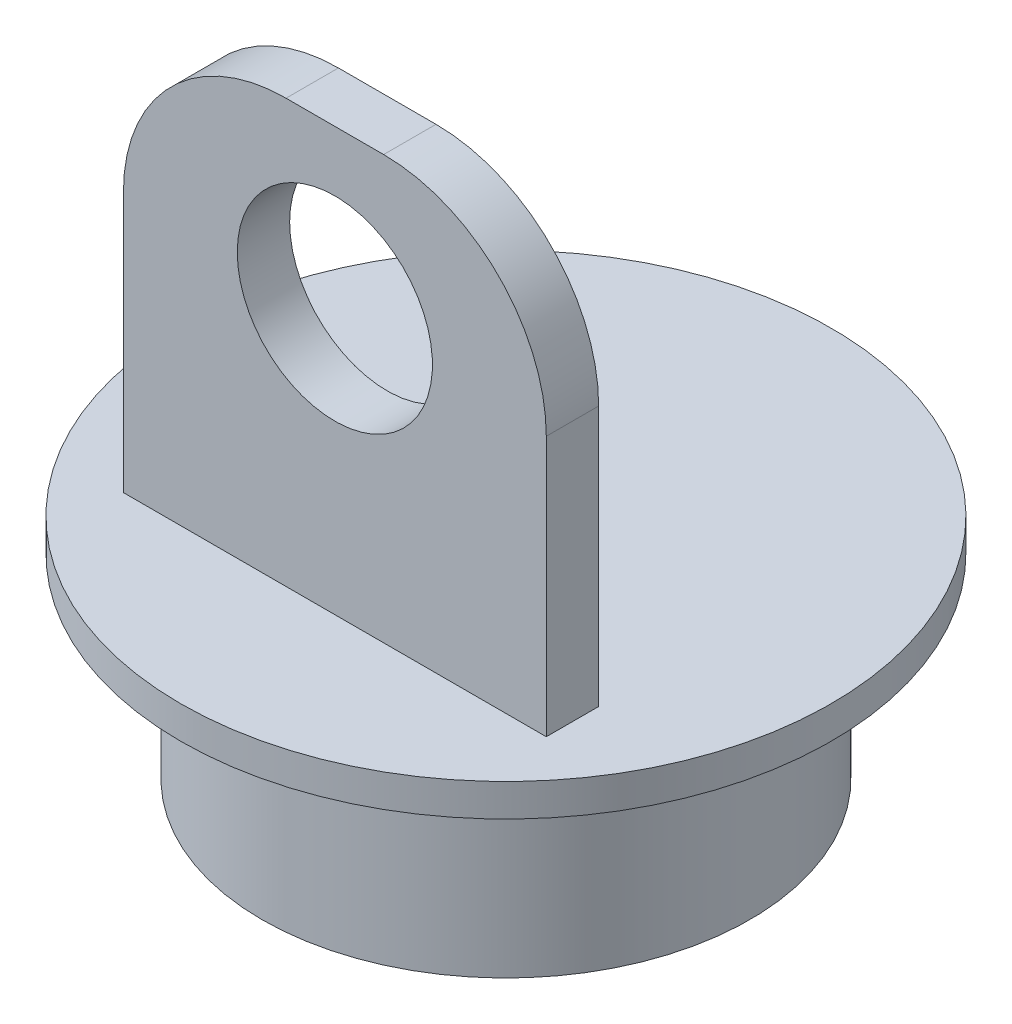
ISO-10303-21;
HEADER;
FILE_DESCRIPTION(('STEP AP214'),'2;1');
FILE_NAME('part.step','',(''),(''),'','','');
FILE_SCHEMA(('AUTOMOTIVE_DESIGN { 1 0 10303 214 1 1 1 1 }'));
ENDSEC;
DATA;
#1=APPLICATION_CONTEXT('core data for automotive mechanical design processes');
#2=APPLICATION_PROTOCOL_DEFINITION('international standard','automotive_design',2000,#1);
#3=PRODUCT_CONTEXT('',#1,'mechanical');
#4=PRODUCT('Part','Part','',(#3));
#5=PRODUCT_RELATED_PRODUCT_CATEGORY('part','',(#4));
#6=PRODUCT_DEFINITION_FORMATION('','',#4);
#7=PRODUCT_DEFINITION_CONTEXT('part definition',#1,'design');
#8=PRODUCT_DEFINITION('design','',#6,#7);
#9=PRODUCT_DEFINITION_SHAPE('','',#8);
#10=(LENGTH_UNIT() NAMED_UNIT(*) SI_UNIT(.MILLI.,.METRE.));
#11=(NAMED_UNIT(*) PLANE_ANGLE_UNIT() SI_UNIT($,.RADIAN.));
#12=(NAMED_UNIT(*) SI_UNIT($,.STERADIAN.) SOLID_ANGLE_UNIT());
#13=UNCERTAINTY_MEASURE_WITH_UNIT(LENGTH_MEASURE(1.E-05),#10,'distance_accuracy_value','');
#14=(GEOMETRIC_REPRESENTATION_CONTEXT(3) GLOBAL_UNCERTAINTY_ASSIGNED_CONTEXT((#13)) GLOBAL_UNIT_ASSIGNED_CONTEXT((#10,
#11,#12)) REPRESENTATION_CONTEXT('',''));
#15=CARTESIAN_POINT('',(0.,0.,0.));
#16=DIRECTION('',(0.,0.,1.));
#17=DIRECTION('',(1.,0.,0.));
#18=AXIS2_PLACEMENT_3D('',#15,#16,#17);
#19=CARTESIAN_POINT('',(0.,35.,0.));
#20=DIRECTION('',(0.,1.,0.));
#21=DIRECTION('',(0.,0.,1.));
#22=AXIS2_PLACEMENT_3D('',#19,#20,#21);
#23=PLANE('',#22);
#24=CARTESIAN_POINT('',(0.,35.,0.));
#25=DIRECTION('',(0.,1.,0.));
#26=DIRECTION('',(0.,0.,1.));
#27=AXIS2_PLACEMENT_3D('',#24,#25,#26);
#28=CIRCLE('',#27,50.);
#29=CARTESIAN_POINT('',(0.,35.,50.));
#30=VERTEX_POINT('',#29);
#31=EDGE_CURVE('E127',#30,#30,#28,.T.);
#32=ORIENTED_EDGE('',*,*,#31,.T.);
#33=EDGE_LOOP('',(#32));
#34=FACE_BOUND('',#33,.T.);
#35=DIRECTION('',(1.,0.,0.));
#36=VECTOR('',#35,1.);
#37=CARTESIAN_POINT('',(-32.5,35.,26.2939562192864));
#38=LINE('',#37,#36);
#39=CARTESIAN_POINT('',(-32.5,35.,26.2939562192864));
#40=VERTEX_POINT('',#39);
#41=CARTESIAN_POINT('',(32.5,35.,26.2939562192864));
#42=VERTEX_POINT('',#41);
#43=EDGE_CURVE('E98',#40,#42,#38,.T.);
#44=ORIENTED_EDGE('',*,*,#43,.F.);
#45=DIRECTION('',(0.,0.,1.));
#46=VECTOR('',#45,1.);
#47=CARTESIAN_POINT('',(-32.5,35.,18.2447859480762));
#48=LINE('',#47,#46);
#49=CARTESIAN_POINT('',(-32.5,35.,18.2447859480762));
#50=VERTEX_POINT('',#49);
#51=EDGE_CURVE('E105',#50,#40,#48,.T.);
#52=ORIENTED_EDGE('',*,*,#51,.F.);
#53=DIRECTION('',(-1.,0.,0.));
#54=VECTOR('',#53,1.);
#55=CARTESIAN_POINT('',(-32.5,35.,18.2447859480762));
#56=LINE('',#55,#54);
#57=CARTESIAN_POINT('',(32.5,35.,18.2447859480762));
#58=VERTEX_POINT('',#57);
#59=EDGE_CURVE('E116',#58,#50,#56,.T.);
#60=ORIENTED_EDGE('',*,*,#59,.F.);
#61=DIRECTION('',(0.,0.,-1.));
#62=VECTOR('',#61,1.);
#63=CARTESIAN_POINT('',(32.5,35.,18.2447859480762));
#64=LINE('',#63,#62);
#65=EDGE_CURVE('E114',#42,#58,#64,.T.);
#66=ORIENTED_EDGE('',*,*,#65,.F.);
#67=EDGE_LOOP('',(#44,#52,#60,#66));
#68=FACE_BOUND('',#67,.T.);
#69=ADVANCED_FACE('F40',(#34,#68),#23,.T.);
#70=CARTESIAN_POINT('',(0.,0.,0.));
#71=DIRECTION('',(0.,1.,0.));
#72=DIRECTION('',(0.,0.,1.));
#73=AXIS2_PLACEMENT_3D('',#70,#71,#72);
#74=PLANE('',#73);
#75=CARTESIAN_POINT('',(0.,0.,0.));
#76=DIRECTION('',(0.,1.,0.));
#77=DIRECTION('',(0.,0.,1.));
#78=AXIS2_PLACEMENT_3D('',#75,#76,#77);
#79=CIRCLE('',#78,37.5);
#80=CARTESIAN_POINT('',(0.,0.,37.5));
#81=VERTEX_POINT('',#80);
#82=EDGE_CURVE('E138',#81,#81,#79,.T.);
#83=ORIENTED_EDGE('',*,*,#82,.F.);
#84=EDGE_LOOP('',(#83));
#85=FACE_BOUND('',#84,.T.);
#86=CARTESIAN_POINT('',(0.,0.,0.));
#87=DIRECTION('',(0.,1.,0.));
#88=DIRECTION('',(0.,0.,1.));
#89=AXIS2_PLACEMENT_3D('',#86,#87,#88);
#90=CIRCLE('',#89,32.5);
#91=CARTESIAN_POINT('',(0.,0.,32.5));
#92=VERTEX_POINT('',#91);
#93=EDGE_CURVE('E135',#92,#92,#90,.T.);
#94=ORIENTED_EDGE('',*,*,#93,.T.);
#95=EDGE_LOOP('',(#94));
#96=FACE_BOUND('',#95,.T.);
#97=ADVANCED_FACE('F174',(#85,#96),#74,.F.);
#98=CARTESIAN_POINT('',(0.,30.,0.));
#99=DIRECTION('',(0.,-1.,0.));
#100=DIRECTION('',(0.,0.,-1.));
#101=AXIS2_PLACEMENT_3D('',#98,#99,#100);
#102=CYLINDRICAL_SURFACE('',#101,37.5);
#103=CARTESIAN_POINT('',(0.,30.,0.));
#104=DIRECTION('',(0.,1.,0.));
#105=DIRECTION('',(0.,0.,1.));
#106=AXIS2_PLACEMENT_3D('',#103,#104,#105);
#107=CIRCLE('',#106,37.5);
#108=CARTESIAN_POINT('',(0.,30.,37.5));
#109=VERTEX_POINT('',#108);
#110=EDGE_CURVE('E139',#109,#109,#107,.T.);
#111=ORIENTED_EDGE('',*,*,#110,.F.);
#112=EDGE_LOOP('',(#111));
#113=FACE_BOUND('',#112,.T.);
#114=ORIENTED_EDGE('',*,*,#82,.T.);
#115=EDGE_LOOP('',(#114));
#116=FACE_BOUND('',#115,.T.);
#117=ADVANCED_FACE('F180',(#113,#116),#102,.T.);
#118=CARTESIAN_POINT('',(0.,30.,0.));
#119=DIRECTION('',(0.,-1.,0.));
#120=DIRECTION('',(0.,0.,-1.));
#121=AXIS2_PLACEMENT_3D('',#118,#119,#120);
#122=CYLINDRICAL_SURFACE('',#121,32.5);
#123=CARTESIAN_POINT('',(0.,30.,0.));
#124=DIRECTION('',(0.,1.,0.));
#125=DIRECTION('',(0.,0.,1.));
#126=AXIS2_PLACEMENT_3D('',#123,#124,#125);
#127=CIRCLE('',#126,32.5);
#128=CARTESIAN_POINT('',(0.,30.,32.5));
#129=VERTEX_POINT('',#128);
#130=EDGE_CURVE('E130',#129,#129,#127,.T.);
#131=ORIENTED_EDGE('',*,*,#130,.T.);
#132=EDGE_LOOP('',(#131));
#133=FACE_BOUND('',#132,.T.);
#134=ORIENTED_EDGE('',*,*,#93,.F.);
#135=EDGE_LOOP('',(#134));
#136=FACE_BOUND('',#135,.T.);
#137=ADVANCED_FACE('F195',(#133,#136),#122,.F.);
#138=CARTESIAN_POINT('',(0.,30.,0.));
#139=DIRECTION('',(0.,1.,0.));
#140=DIRECTION('',(0.,0.,1.));
#141=AXIS2_PLACEMENT_3D('',#138,#139,#140);
#142=PLANE('',#141);
#143=ORIENTED_EDGE('',*,*,#130,.F.);
#144=EDGE_LOOP('',(#143));
#145=FACE_BOUND('',#144,.T.);
#146=ADVANCED_FACE('F191',(#145),#142,.F.);
#147=CARTESIAN_POINT('',(0.,35.,0.));
#148=DIRECTION('',(0.,-1.,0.));
#149=DIRECTION('',(0.,0.,-1.));
#150=AXIS2_PLACEMENT_3D('',#147,#148,#149);
#151=CYLINDRICAL_SURFACE('',#150,50.);
#152=ORIENTED_EDGE('',*,*,#31,.F.);
#153=EDGE_LOOP('',(#152));
#154=FACE_BOUND('',#153,.T.);
#155=CARTESIAN_POINT('',(0.,30.,0.));
#156=DIRECTION('',(0.,1.,0.));
#157=DIRECTION('',(0.,0.,1.));
#158=AXIS2_PLACEMENT_3D('',#155,#156,#157);
#159=CIRCLE('',#158,50.);
#160=CARTESIAN_POINT('',(0.,30.,50.));
#161=VERTEX_POINT('',#160);
#162=EDGE_CURVE('E101',#161,#161,#159,.T.);
#163=ORIENTED_EDGE('',*,*,#162,.T.);
#164=EDGE_LOOP('',(#163));
#165=FACE_BOUND('',#164,.T.);
#166=ADVANCED_FACE('F189',(#154,#165),#151,.T.);
#167=ORIENTED_EDGE('',*,*,#110,.T.);
#168=EDGE_LOOP('',(#167));
#169=FACE_BOUND('',#168,.T.);
#170=ORIENTED_EDGE('',*,*,#162,.F.);
#171=EDGE_LOOP('',(#170));
#172=FACE_BOUND('',#171,.T.);
#173=ADVANCED_FACE('F186',(#169,#172),#142,.F.);
#174=CARTESIAN_POINT('',(-32.5,100.,18.2447859480762));
#175=DIRECTION('',(1.,0.,0.));
#176=DIRECTION('',(0.,0.,-1.));
#177=AXIS2_PLACEMENT_3D('',#174,#175,#176);
#178=PLANE('',#177);
#179=DIRECTION('',(0.,-1.,0.));
#180=VECTOR('',#179,1.);
#181=CARTESIAN_POINT('',(-32.5,100.,26.2939562192864));
#182=LINE('',#181,#180);
#183=CARTESIAN_POINT('',(-32.5,75.,26.2939562192864));
#184=VERTEX_POINT('',#183);
#185=EDGE_CURVE('E92',#184,#40,#182,.T.);
#186=ORIENTED_EDGE('',*,*,#185,.F.);
#187=DIRECTION('',(0.,0.,1.));
#188=VECTOR('',#187,1.);
#189=CARTESIAN_POINT('',(-32.5,75.,18.2447859480762));
#190=LINE('',#189,#188);
#191=CARTESIAN_POINT('',(-32.5,75.,18.2447859480762));
#192=VERTEX_POINT('',#191);
#193=EDGE_CURVE('E63',#184,#192,#190,.F.);
#194=ORIENTED_EDGE('',*,*,#193,.T.);
#195=DIRECTION('',(0.,-1.,0.));
#196=VECTOR('',#195,1.);
#197=CARTESIAN_POINT('',(-32.5,100.,18.2447859480762));
#198=LINE('',#197,#196);
#199=EDGE_CURVE('E107',#192,#50,#198,.T.);
#200=ORIENTED_EDGE('',*,*,#199,.T.);
#201=ORIENTED_EDGE('',*,*,#51,.T.);
#202=EDGE_LOOP('',(#186,#194,#200,#201));
#203=FACE_BOUND('',#202,.T.);
#204=ADVANCED_FACE('F106',(#203),#178,.F.);
#205=CARTESIAN_POINT('',(-32.5,100.,26.2939562192864));
#206=DIRECTION('',(0.,0.,-1.));
#207=DIRECTION('',(-1.,0.,0.));
#208=AXIS2_PLACEMENT_3D('',#205,#206,#207);
#209=PLANE('',#208);
#210=CARTESIAN_POINT('',(0.,75.7573448678723,26.2939562192864));
#211=DIRECTION('',(0.,0.,-1.));
#212=DIRECTION('',(-1.,0.,0.));
#213=AXIS2_PLACEMENT_3D('',#210,#211,#212);
#214=CIRCLE('',#213,15.);
#215=CARTESIAN_POINT('',(-15.,75.7573448678723,26.2939562192864));
#216=VERTEX_POINT('',#215);
#217=EDGE_CURVE('E111',#216,#216,#214,.T.);
#218=ORIENTED_EDGE('',*,*,#217,.T.);
#219=EDGE_LOOP('',(#218));
#220=FACE_BOUND('',#219,.T.);
#221=DIRECTION('',(1.,0.,0.));
#222=VECTOR('',#221,1.);
#223=CARTESIAN_POINT('',(-32.5,100.,26.2939562192864));
#224=LINE('',#223,#222);
#225=CARTESIAN_POINT('',(-7.5,100.,26.2939562192864));
#226=VERTEX_POINT('',#225);
#227=CARTESIAN_POINT('',(7.5,100.,26.2939562192864));
#228=VERTEX_POINT('',#227);
#229=EDGE_CURVE('E121',#226,#228,#224,.T.);
#230=ORIENTED_EDGE('',*,*,#229,.F.);
#231=CARTESIAN_POINT('',(-7.5,75.,26.2939562192864));
#232=DIRECTION('',(0.,0.,-1.));
#233=DIRECTION('',(-1.,0.,0.));
#234=AXIS2_PLACEMENT_3D('',#231,#232,#233);
#235=CIRCLE('',#234,25.);
#236=EDGE_CURVE('E100',#226,#184,#235,.F.);
#237=ORIENTED_EDGE('',*,*,#236,.T.);
#238=ORIENTED_EDGE('',*,*,#185,.T.);
#239=ORIENTED_EDGE('',*,*,#43,.T.);
#240=DIRECTION('',(0.,-1.,0.));
#241=VECTOR('',#240,1.);
#242=CARTESIAN_POINT('',(32.5,100.,26.2939562192864));
#243=LINE('',#242,#241);
#244=CARTESIAN_POINT('',(32.5,75.,26.2939562192864));
#245=VERTEX_POINT('',#244);
#246=EDGE_CURVE('E102',#245,#42,#243,.T.);
#247=ORIENTED_EDGE('',*,*,#246,.F.);
#248=CARTESIAN_POINT('',(7.5,75.,26.2939562192864));
#249=DIRECTION('',(0.,0.,-1.));
#250=DIRECTION('',(-1.,0.,0.));
#251=AXIS2_PLACEMENT_3D('',#248,#249,#250);
#252=CIRCLE('',#251,25.);
#253=EDGE_CURVE('E150',#245,#228,#252,.F.);
#254=ORIENTED_EDGE('',*,*,#253,.T.);
#255=EDGE_LOOP('',(#230,#237,#238,#239,#247,#254));
#256=FACE_BOUND('',#255,.T.);
#257=ADVANCED_FACE('F95',(#220,#256),#209,.F.);
#258=CARTESIAN_POINT('',(32.5,100.,18.2447859480762));
#259=DIRECTION('',(-1.,0.,0.));
#260=DIRECTION('',(0.,0.,1.));
#261=AXIS2_PLACEMENT_3D('',#258,#259,#260);
#262=PLANE('',#261);
#263=DIRECTION('',(0.,-1.,0.));
#264=VECTOR('',#263,1.);
#265=CARTESIAN_POINT('',(32.5,100.,18.2447859480762));
#266=LINE('',#265,#264);
#267=CARTESIAN_POINT('',(32.5,75.,18.2447859480762));
#268=VERTEX_POINT('',#267);
#269=EDGE_CURVE('E123',#268,#58,#266,.T.);
#270=ORIENTED_EDGE('',*,*,#269,.F.);
#271=DIRECTION('',(0.,0.,-1.));
#272=VECTOR('',#271,1.);
#273=CARTESIAN_POINT('',(32.5,75.,26.2939562192864));
#274=LINE('',#273,#272);
#275=EDGE_CURVE('E11',#268,#245,#274,.F.);
#276=ORIENTED_EDGE('',*,*,#275,.T.);
#277=ORIENTED_EDGE('',*,*,#246,.T.);
#278=ORIENTED_EDGE('',*,*,#65,.T.);
#279=EDGE_LOOP('',(#270,#276,#277,#278));
#280=FACE_BOUND('',#279,.T.);
#281=ADVANCED_FACE('F242',(#280),#262,.F.);
#282=CARTESIAN_POINT('',(-32.5,100.,18.2447859480762));
#283=DIRECTION('',(0.,0.,1.));
#284=DIRECTION('',(1.,0.,0.));
#285=AXIS2_PLACEMENT_3D('',#282,#283,#284);
#286=PLANE('',#285);
#287=CARTESIAN_POINT('',(0.,75.7573448678723,18.2447859480762));
#288=DIRECTION('',(0.,0.,-1.));
#289=DIRECTION('',(-1.,0.,0.));
#290=AXIS2_PLACEMENT_3D('',#287,#288,#289);
#291=CIRCLE('',#290,15.);
#292=CARTESIAN_POINT('',(-15.,75.7573448678723,18.2447859480762));
#293=VERTEX_POINT('',#292);
#294=EDGE_CURVE('E318',#293,#293,#291,.T.);
#295=ORIENTED_EDGE('',*,*,#294,.F.);
#296=EDGE_LOOP('',(#295));
#297=FACE_BOUND('',#296,.T.);
#298=ORIENTED_EDGE('',*,*,#199,.F.);
#299=CARTESIAN_POINT('',(-7.5,75.,18.2447859480762));
#300=DIRECTION('',(0.,0.,1.));
#301=DIRECTION('',(1.,0.,0.));
#302=AXIS2_PLACEMENT_3D('',#299,#300,#301);
#303=CIRCLE('',#302,25.);
#304=CARTESIAN_POINT('',(-7.5,100.,18.2447859480762));
#305=VERTEX_POINT('',#304);
#306=EDGE_CURVE('E48',#192,#305,#303,.F.);
#307=ORIENTED_EDGE('',*,*,#306,.T.);
#308=DIRECTION('',(-1.,0.,0.));
#309=VECTOR('',#308,1.);
#310=CARTESIAN_POINT('',(-32.5,100.,18.2447859480762));
#311=LINE('',#310,#309);
#312=CARTESIAN_POINT('',(7.5,100.,18.2447859480762));
#313=VERTEX_POINT('',#312);
#314=EDGE_CURVE('E124',#313,#305,#311,.T.);
#315=ORIENTED_EDGE('',*,*,#314,.F.);
#316=CARTESIAN_POINT('',(7.5,75.,18.2447859480762));
#317=DIRECTION('',(0.,0.,1.));
#318=DIRECTION('',(1.,0.,0.));
#319=AXIS2_PLACEMENT_3D('',#316,#317,#318);
#320=CIRCLE('',#319,25.);
#321=EDGE_CURVE('E55',#313,#268,#320,.F.);
#322=ORIENTED_EDGE('',*,*,#321,.T.);
#323=ORIENTED_EDGE('',*,*,#269,.T.);
#324=ORIENTED_EDGE('',*,*,#59,.T.);
#325=EDGE_LOOP('',(#298,#307,#315,#322,#323,#324));
#326=FACE_BOUND('',#325,.T.);
#327=ADVANCED_FACE('F156',(#297,#326),#286,.F.);
#328=CARTESIAN_POINT('',(0.,100.,0.));
#329=DIRECTION('',(0.,1.,0.));
#330=DIRECTION('',(0.,0.,1.));
#331=AXIS2_PLACEMENT_3D('',#328,#329,#330);
#332=PLANE('',#331);
#333=ORIENTED_EDGE('',*,*,#314,.T.);
#334=DIRECTION('',(0.,0.,1.));
#335=VECTOR('',#334,1.);
#336=CARTESIAN_POINT('',(-7.5,100.,26.2939562192864));
#337=LINE('',#336,#335);
#338=EDGE_CURVE('E147',#305,#226,#337,.T.);
#339=ORIENTED_EDGE('',*,*,#338,.T.);
#340=ORIENTED_EDGE('',*,*,#229,.T.);
#341=DIRECTION('',(0.,0.,-1.));
#342=VECTOR('',#341,1.);
#343=CARTESIAN_POINT('',(7.5,100.,18.2447859480762));
#344=LINE('',#343,#342);
#345=EDGE_CURVE('E142',#228,#313,#344,.T.);
#346=ORIENTED_EDGE('',*,*,#345,.T.);
#347=EDGE_LOOP('',(#333,#339,#340,#346));
#348=FACE_BOUND('',#347,.T.);
#349=ADVANCED_FACE('F160',(#348),#332,.T.);
#350=CARTESIAN_POINT('',(-7.5,75.,0.));
#351=DIRECTION('',(0.,0.,-1.));
#352=DIRECTION('',(-1.,0.,0.));
#353=AXIS2_PLACEMENT_3D('',#350,#351,#352);
#354=CYLINDRICAL_SURFACE('',#353,25.);
#355=ORIENTED_EDGE('',*,*,#306,.F.);
#356=ORIENTED_EDGE('',*,*,#193,.F.);
#357=ORIENTED_EDGE('',*,*,#236,.F.);
#358=ORIENTED_EDGE('',*,*,#338,.F.);
#359=EDGE_LOOP('',(#355,#356,#357,#358));
#360=FACE_BOUND('',#359,.T.);
#361=ADVANCED_FACE('F163',(#360),#354,.T.);
#362=CARTESIAN_POINT('',(7.5,75.,0.));
#363=DIRECTION('',(0.,0.,1.));
#364=DIRECTION('',(1.,0.,0.));
#365=AXIS2_PLACEMENT_3D('',#362,#363,#364);
#366=CYLINDRICAL_SURFACE('',#365,25.);
#367=ORIENTED_EDGE('',*,*,#253,.F.);
#368=ORIENTED_EDGE('',*,*,#275,.F.);
#369=ORIENTED_EDGE('',*,*,#321,.F.);
#370=ORIENTED_EDGE('',*,*,#345,.F.);
#371=EDGE_LOOP('',(#367,#368,#369,#370));
#372=FACE_BOUND('',#371,.T.);
#373=ADVANCED_FACE('F42',(#372),#366,.T.);
#374=CARTESIAN_POINT('',(0.,75.7573448678723,28.2447859480762));
#375=DIRECTION('',(0.,0.,-1.));
#376=DIRECTION('',(-1.,0.,0.));
#377=AXIS2_PLACEMENT_3D('',#374,#375,#376);
#378=CYLINDRICAL_SURFACE('',#377,15.);
#379=ORIENTED_EDGE('',*,*,#294,.T.);
#380=EDGE_LOOP('',(#379));
#381=FACE_BOUND('',#380,.T.);
#382=ORIENTED_EDGE('',*,*,#217,.F.);
#383=EDGE_LOOP('',(#382));
#384=FACE_BOUND('',#383,.T.);
#385=ADVANCED_FACE('F169',(#381,#384),#378,.F.);
#386=CLOSED_SHELL('',(#69,#97,#117,#137,#146,#166,#173,#204,#257,#281,#327,#349,#361,#373,#385));
#387=MANIFOLD_SOLID_BREP('B2',#386);
#388=ADVANCED_BREP_SHAPE_REPRESENTATION('',(#18,#387),#14);
#389=SHAPE_DEFINITION_REPRESENTATION(#9,#388);
ENDSEC;
END-ISO-10303-21;
